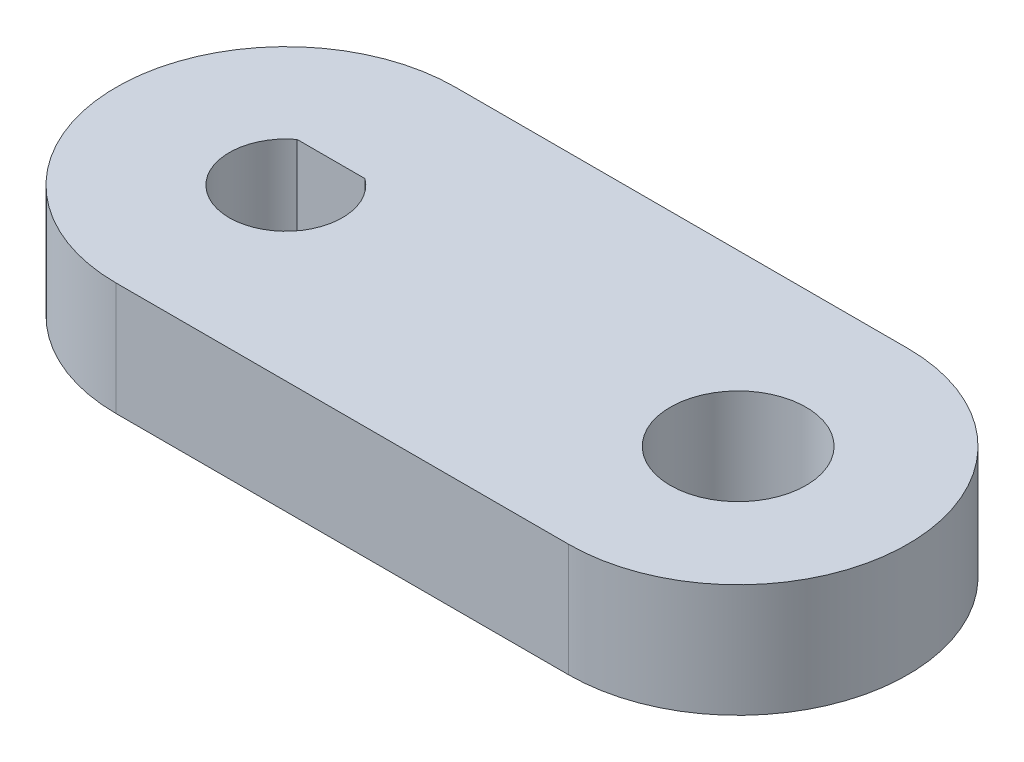
ISO-10303-21;
HEADER;
FILE_DESCRIPTION(('STEP AP214'),'2;1');
FILE_NAME('part.step','',(''),(''),'','','');
FILE_SCHEMA(('AUTOMOTIVE_DESIGN { 1 0 10303 214 1 1 1 1 }'));
ENDSEC;
DATA;
#1=APPLICATION_CONTEXT('core data for automotive mechanical design processes');
#2=APPLICATION_PROTOCOL_DEFINITION('international standard','automotive_design',2000,#1);
#3=PRODUCT_CONTEXT('',#1,'mechanical');
#4=PRODUCT('Part','Part','',(#3));
#5=PRODUCT_RELATED_PRODUCT_CATEGORY('part','',(#4));
#6=PRODUCT_DEFINITION_FORMATION('','',#4);
#7=PRODUCT_DEFINITION_CONTEXT('part definition',#1,'design');
#8=PRODUCT_DEFINITION('design','',#6,#7);
#9=PRODUCT_DEFINITION_SHAPE('','',#8);
#10=(LENGTH_UNIT() NAMED_UNIT(*) SI_UNIT(.MILLI.,.METRE.));
#11=(NAMED_UNIT(*) PLANE_ANGLE_UNIT() SI_UNIT($,.RADIAN.));
#12=(NAMED_UNIT(*) SI_UNIT($,.STERADIAN.) SOLID_ANGLE_UNIT());
#13=UNCERTAINTY_MEASURE_WITH_UNIT(LENGTH_MEASURE(1.E-05),#10,'distance_accuracy_value','');
#14=(GEOMETRIC_REPRESENTATION_CONTEXT(3) GLOBAL_UNCERTAINTY_ASSIGNED_CONTEXT((#13)) GLOBAL_UNIT_ASSIGNED_CONTEXT((#10,
#11,#12)) REPRESENTATION_CONTEXT('',''));
#15=CARTESIAN_POINT('',(0.,0.,0.));
#16=DIRECTION('',(0.,0.,1.));
#17=DIRECTION('',(1.,0.,0.));
#18=AXIS2_PLACEMENT_3D('',#15,#16,#17);
#19=CARTESIAN_POINT('',(0.,5.,0.));
#20=DIRECTION('',(0.,1.,0.));
#21=DIRECTION('',(0.,0.,1.));
#22=AXIS2_PLACEMENT_3D('',#19,#20,#21);
#23=PLANE('',#22);
#24=CARTESIAN_POINT('',(0.,5.,0.));
#25=DIRECTION('',(0.,1.,0.));
#26=DIRECTION('',(0.,0.,1.));
#27=AXIS2_PLACEMENT_3D('',#24,#25,#26);
#28=CIRCLE('',#27,7.5);
#29=CARTESIAN_POINT('',(0.,5.,-7.5));
#30=VERTEX_POINT('',#29);
#31=CARTESIAN_POINT('',(0.,5.,7.5));
#32=VERTEX_POINT('',#31);
#33=EDGE_CURVE('E116',#30,#32,#28,.T.);
#34=ORIENTED_EDGE('',*,*,#33,.T.);
#35=DIRECTION('',(1.,0.,0.));
#36=VECTOR('',#35,1.);
#37=CARTESIAN_POINT('',(0.,5.,7.5));
#38=LINE('',#37,#36);
#39=CARTESIAN_POINT('',(20.,5.,7.5));
#40=VERTEX_POINT('',#39);
#41=EDGE_CURVE('E119',#32,#40,#38,.T.);
#42=ORIENTED_EDGE('',*,*,#41,.T.);
#43=CARTESIAN_POINT('',(20.,5.,0.));
#44=DIRECTION('',(0.,1.,0.));
#45=DIRECTION('',(0.,0.,1.));
#46=AXIS2_PLACEMENT_3D('',#43,#44,#45);
#47=CIRCLE('',#46,7.5);
#48=CARTESIAN_POINT('',(20.,5.,-7.5));
#49=VERTEX_POINT('',#48);
#50=EDGE_CURVE('E122',#40,#49,#47,.T.);
#51=ORIENTED_EDGE('',*,*,#50,.T.);
#52=DIRECTION('',(-1.,0.,0.));
#53=VECTOR('',#52,1.);
#54=CARTESIAN_POINT('',(0.,5.,-7.5));
#55=LINE('',#54,#53);
#56=EDGE_CURVE('E124',#49,#30,#55,.T.);
#57=ORIENTED_EDGE('',*,*,#56,.T.);
#58=EDGE_LOOP('',(#34,#42,#51,#57));
#59=FACE_BOUND('',#58,.T.);
#60=CARTESIAN_POINT('',(20.,5.,0.));
#61=DIRECTION('',(0.,1.,0.));
#62=DIRECTION('',(0.,0.,1.));
#63=AXIS2_PLACEMENT_3D('',#60,#61,#62);
#64=CIRCLE('',#63,3.);
#65=CARTESIAN_POINT('',(20.,5.,3.));
#66=VERTEX_POINT('',#65);
#67=EDGE_CURVE('E110',#66,#66,#64,.T.);
#68=ORIENTED_EDGE('',*,*,#67,.F.);
#69=EDGE_LOOP('',(#68));
#70=FACE_BOUND('',#69,.T.);
#71=DIRECTION('',(-1.,0.,0.));
#72=VECTOR('',#71,1.);
#73=CARTESIAN_POINT('',(1.5,5.,-2.));
#74=LINE('',#73,#72);
#75=CARTESIAN_POINT('',(1.5,5.,-2.));
#76=VERTEX_POINT('',#75);
#77=CARTESIAN_POINT('',(-1.5,5.,-2.));
#78=VERTEX_POINT('',#77);
#79=EDGE_CURVE('E93',#76,#78,#74,.T.);
#80=ORIENTED_EDGE('',*,*,#79,.F.);
#81=CARTESIAN_POINT('',(0.,5.,0.));
#82=DIRECTION('',(0.,1.,0.));
#83=DIRECTION('',(0.,0.,1.));
#84=AXIS2_PLACEMENT_3D('',#81,#82,#83);
#85=CIRCLE('',#84,2.5);
#86=EDGE_CURVE('E99',#78,#76,#85,.T.);
#87=ORIENTED_EDGE('',*,*,#86,.F.);
#88=EDGE_LOOP('',(#80,#87));
#89=FACE_BOUND('',#88,.T.);
#90=ADVANCED_FACE('F41',(#59,#70,#89),#23,.T.);
#91=CARTESIAN_POINT('',(0.,0.,0.));
#92=DIRECTION('',(0.,1.,0.));
#93=DIRECTION('',(0.,0.,1.));
#94=AXIS2_PLACEMENT_3D('',#91,#92,#93);
#95=PLANE('',#94);
#96=CARTESIAN_POINT('',(20.,0.,0.));
#97=DIRECTION('',(0.,1.,0.));
#98=DIRECTION('',(0.,0.,1.));
#99=AXIS2_PLACEMENT_3D('',#96,#97,#98);
#100=CIRCLE('',#99,3.);
#101=CARTESIAN_POINT('',(20.,0.,3.));
#102=VERTEX_POINT('',#101);
#103=EDGE_CURVE('E109',#102,#102,#100,.T.);
#104=ORIENTED_EDGE('',*,*,#103,.T.);
#105=EDGE_LOOP('',(#104));
#106=FACE_BOUND('',#105,.T.);
#107=CARTESIAN_POINT('',(0.,0.,0.));
#108=DIRECTION('',(0.,1.,0.));
#109=DIRECTION('',(0.,0.,1.));
#110=AXIS2_PLACEMENT_3D('',#107,#108,#109);
#111=CIRCLE('',#110,7.5);
#112=CARTESIAN_POINT('',(0.,0.,-7.5));
#113=VERTEX_POINT('',#112);
#114=CARTESIAN_POINT('',(0.,0.,7.5));
#115=VERTEX_POINT('',#114);
#116=EDGE_CURVE('E113',#113,#115,#111,.T.);
#117=ORIENTED_EDGE('',*,*,#116,.F.);
#118=DIRECTION('',(-1.,0.,0.));
#119=VECTOR('',#118,1.);
#120=CARTESIAN_POINT('',(0.,0.,-7.5));
#121=LINE('',#120,#119);
#122=CARTESIAN_POINT('',(20.,0.,-7.5));
#123=VERTEX_POINT('',#122);
#124=EDGE_CURVE('E120',#123,#113,#121,.T.);
#125=ORIENTED_EDGE('',*,*,#124,.F.);
#126=CARTESIAN_POINT('',(20.,0.,0.));
#127=DIRECTION('',(0.,1.,0.));
#128=DIRECTION('',(0.,0.,1.));
#129=AXIS2_PLACEMENT_3D('',#126,#127,#128);
#130=CIRCLE('',#129,7.5);
#131=CARTESIAN_POINT('',(20.,0.,7.5));
#132=VERTEX_POINT('',#131);
#133=EDGE_CURVE('E131',#132,#123,#130,.T.);
#134=ORIENTED_EDGE('',*,*,#133,.F.);
#135=DIRECTION('',(1.,0.,0.));
#136=VECTOR('',#135,1.);
#137=CARTESIAN_POINT('',(0.,0.,7.5));
#138=LINE('',#137,#136);
#139=EDGE_CURVE('E129',#115,#132,#138,.T.);
#140=ORIENTED_EDGE('',*,*,#139,.F.);
#141=EDGE_LOOP('',(#117,#125,#134,#140));
#142=FACE_BOUND('',#141,.T.);
#143=CARTESIAN_POINT('',(0.,0.,0.));
#144=DIRECTION('',(0.,1.,0.));
#145=DIRECTION('',(0.,0.,1.));
#146=AXIS2_PLACEMENT_3D('',#143,#144,#145);
#147=CIRCLE('',#146,2.5);
#148=CARTESIAN_POINT('',(-1.5,0.,-2.));
#149=VERTEX_POINT('',#148);
#150=CARTESIAN_POINT('',(1.5,0.,-2.));
#151=VERTEX_POINT('',#150);
#152=EDGE_CURVE('E63',#149,#151,#147,.T.);
#153=ORIENTED_EDGE('',*,*,#152,.T.);
#154=DIRECTION('',(-1.,0.,0.));
#155=VECTOR('',#154,1.);
#156=CARTESIAN_POINT('',(1.5,0.,-2.));
#157=LINE('',#156,#155);
#158=EDGE_CURVE('E103',#151,#149,#157,.T.);
#159=ORIENTED_EDGE('',*,*,#158,.T.);
#160=EDGE_LOOP('',(#153,#159));
#161=FACE_BOUND('',#160,.T.);
#162=ADVANCED_FACE('F149',(#106,#142,#161),#95,.F.);
#163=CARTESIAN_POINT('',(0.,5.,0.));
#164=DIRECTION('',(0.,-1.,0.));
#165=DIRECTION('',(0.,0.,-1.));
#166=AXIS2_PLACEMENT_3D('',#163,#164,#165);
#167=CYLINDRICAL_SURFACE('',#166,7.5);
#168=ORIENTED_EDGE('',*,*,#116,.T.);
#169=DIRECTION('',(0.,-1.,0.));
#170=VECTOR('',#169,1.);
#171=CARTESIAN_POINT('',(0.,5.,7.5));
#172=LINE('',#171,#170);
#173=EDGE_CURVE('E11',#32,#115,#172,.T.);
#174=ORIENTED_EDGE('',*,*,#173,.F.);
#175=ORIENTED_EDGE('',*,*,#33,.F.);
#176=DIRECTION('',(0.,-1.,0.));
#177=VECTOR('',#176,1.);
#178=CARTESIAN_POINT('',(0.,5.,-7.5));
#179=LINE('',#178,#177);
#180=EDGE_CURVE('E126',#30,#113,#179,.T.);
#181=ORIENTED_EDGE('',*,*,#180,.T.);
#182=EDGE_LOOP('',(#168,#174,#175,#181));
#183=FACE_BOUND('',#182,.T.);
#184=ADVANCED_FACE('F43',(#183),#167,.T.);
#185=CARTESIAN_POINT('',(0.,5.,7.5));
#186=DIRECTION('',(0.,0.,-1.));
#187=DIRECTION('',(-1.,0.,0.));
#188=AXIS2_PLACEMENT_3D('',#185,#186,#187);
#189=PLANE('',#188);
#190=ORIENTED_EDGE('',*,*,#139,.T.);
#191=DIRECTION('',(0.,-1.,0.));
#192=VECTOR('',#191,1.);
#193=CARTESIAN_POINT('',(20.,5.,7.5));
#194=LINE('',#193,#192);
#195=EDGE_CURVE('E49',#40,#132,#194,.T.);
#196=ORIENTED_EDGE('',*,*,#195,.F.);
#197=ORIENTED_EDGE('',*,*,#41,.F.);
#198=ORIENTED_EDGE('',*,*,#173,.T.);
#199=EDGE_LOOP('',(#190,#196,#197,#198));
#200=FACE_BOUND('',#199,.T.);
#201=ADVANCED_FACE('F160',(#200),#189,.F.);
#202=CARTESIAN_POINT('',(20.,5.,0.));
#203=DIRECTION('',(0.,-1.,0.));
#204=DIRECTION('',(0.,0.,-1.));
#205=AXIS2_PLACEMENT_3D('',#202,#203,#204);
#206=CYLINDRICAL_SURFACE('',#205,7.5);
#207=ORIENTED_EDGE('',*,*,#133,.T.);
#208=DIRECTION('',(0.,-1.,0.));
#209=VECTOR('',#208,1.);
#210=CARTESIAN_POINT('',(20.,5.,-7.5));
#211=LINE('',#210,#209);
#212=EDGE_CURVE('E136',#49,#123,#211,.T.);
#213=ORIENTED_EDGE('',*,*,#212,.F.);
#214=ORIENTED_EDGE('',*,*,#50,.F.);
#215=ORIENTED_EDGE('',*,*,#195,.T.);
#216=EDGE_LOOP('',(#207,#213,#214,#215));
#217=FACE_BOUND('',#216,.T.);
#218=ADVANCED_FACE('F143',(#217),#206,.T.);
#219=CARTESIAN_POINT('',(0.,5.,-7.5));
#220=DIRECTION('',(0.,0.,1.));
#221=DIRECTION('',(1.,0.,0.));
#222=AXIS2_PLACEMENT_3D('',#219,#220,#221);
#223=PLANE('',#222);
#224=ORIENTED_EDGE('',*,*,#124,.T.);
#225=ORIENTED_EDGE('',*,*,#180,.F.);
#226=ORIENTED_EDGE('',*,*,#56,.F.);
#227=ORIENTED_EDGE('',*,*,#212,.T.);
#228=EDGE_LOOP('',(#224,#225,#226,#227));
#229=FACE_BOUND('',#228,.T.);
#230=ADVANCED_FACE('F153',(#229),#223,.F.);
#231=CARTESIAN_POINT('',(20.,5.,0.));
#232=DIRECTION('',(0.,-1.,0.));
#233=DIRECTION('',(0.,0.,-1.));
#234=AXIS2_PLACEMENT_3D('',#231,#232,#233);
#235=CYLINDRICAL_SURFACE('',#234,3.);
#236=ORIENTED_EDGE('',*,*,#67,.T.);
#237=EDGE_LOOP('',(#236));
#238=FACE_BOUND('',#237,.T.);
#239=ORIENTED_EDGE('',*,*,#103,.F.);
#240=EDGE_LOOP('',(#239));
#241=FACE_BOUND('',#240,.T.);
#242=ADVANCED_FACE('F175',(#238,#241),#235,.F.);
#243=CARTESIAN_POINT('',(0.,5.,0.));
#244=DIRECTION('',(0.,-1.,0.));
#245=DIRECTION('',(0.,0.,-1.));
#246=AXIS2_PLACEMENT_3D('',#243,#244,#245);
#247=CYLINDRICAL_SURFACE('',#246,2.5);
#248=ORIENTED_EDGE('',*,*,#152,.F.);
#249=DIRECTION('',(0.,-1.,0.));
#250=VECTOR('',#249,1.);
#251=CARTESIAN_POINT('',(-1.5,5.,-2.));
#252=LINE('',#251,#250);
#253=EDGE_CURVE('E95',#78,#149,#252,.T.);
#254=ORIENTED_EDGE('',*,*,#253,.F.);
#255=ORIENTED_EDGE('',*,*,#86,.T.);
#256=DIRECTION('',(0.,-1.,0.));
#257=VECTOR('',#256,1.);
#258=CARTESIAN_POINT('',(1.5,5.,-2.));
#259=LINE('',#258,#257);
#260=EDGE_CURVE('E56',#76,#151,#259,.T.);
#261=ORIENTED_EDGE('',*,*,#260,.T.);
#262=EDGE_LOOP('',(#248,#254,#255,#261));
#263=FACE_BOUND('',#262,.T.);
#264=ADVANCED_FACE('F101',(#263),#247,.F.);
#265=CARTESIAN_POINT('',(1.5,5.,-2.));
#266=DIRECTION('',(0.,0.,1.));
#267=DIRECTION('',(1.,0.,0.));
#268=AXIS2_PLACEMENT_3D('',#265,#266,#267);
#269=PLANE('',#268);
#270=ORIENTED_EDGE('',*,*,#158,.F.);
#271=ORIENTED_EDGE('',*,*,#260,.F.);
#272=ORIENTED_EDGE('',*,*,#79,.T.);
#273=ORIENTED_EDGE('',*,*,#253,.T.);
#274=EDGE_LOOP('',(#270,#271,#272,#273));
#275=FACE_BOUND('',#274,.T.);
#276=ADVANCED_FACE('F94',(#275),#269,.T.);
#277=CLOSED_SHELL('',(#90,#162,#184,#201,#218,#230,#242,#264,#276));
#278=MANIFOLD_SOLID_BREP('B2',#277);
#279=ADVANCED_BREP_SHAPE_REPRESENTATION('',(#18,#278),#14);
#280=SHAPE_DEFINITION_REPRESENTATION(#9,#279);
ENDSEC;
END-ISO-10303-21;
